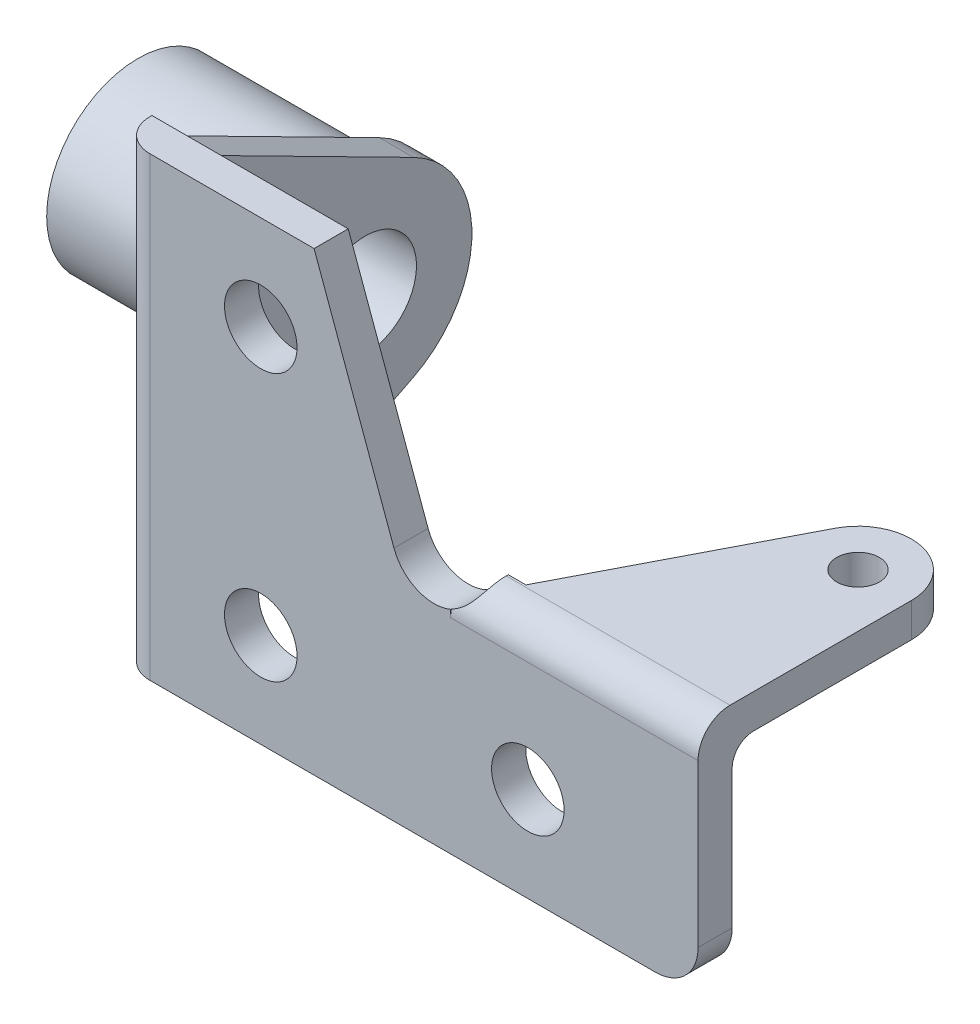
ISO-10303-21;
HEADER;
FILE_DESCRIPTION(('STEP AP214'),'2;1');
FILE_NAME('part.step','',(''),(''),'','','');
FILE_SCHEMA(('AUTOMOTIVE_DESIGN { 1 0 10303 214 1 1 1 1 }'));
ENDSEC;
DATA;
#1=APPLICATION_CONTEXT('core data for automotive mechanical design processes');
#2=APPLICATION_PROTOCOL_DEFINITION('international standard','automotive_design',2000,#1);
#3=PRODUCT_CONTEXT('',#1,'mechanical');
#4=PRODUCT('Part','Part','',(#3));
#5=PRODUCT_RELATED_PRODUCT_CATEGORY('part','',(#4));
#6=PRODUCT_DEFINITION_FORMATION('','',#4);
#7=PRODUCT_DEFINITION_CONTEXT('part definition',#1,'design');
#8=PRODUCT_DEFINITION('design','',#6,#7);
#9=PRODUCT_DEFINITION_SHAPE('','',#8);
#10=(LENGTH_UNIT() NAMED_UNIT(*) SI_UNIT(.MILLI.,.METRE.));
#11=(NAMED_UNIT(*) PLANE_ANGLE_UNIT() SI_UNIT($,.RADIAN.));
#12=(NAMED_UNIT(*) SI_UNIT($,.STERADIAN.) SOLID_ANGLE_UNIT());
#13=UNCERTAINTY_MEASURE_WITH_UNIT(LENGTH_MEASURE(1.E-05),#10,'distance_accuracy_value','');
#14=(GEOMETRIC_REPRESENTATION_CONTEXT(3) GLOBAL_UNCERTAINTY_ASSIGNED_CONTEXT((#13)) GLOBAL_UNIT_ASSIGNED_CONTEXT((#10,
#11,#12)) REPRESENTATION_CONTEXT('',''));
#15=CARTESIAN_POINT('',(0.,0.,0.));
#16=DIRECTION('',(0.,0.,1.));
#17=DIRECTION('',(1.,0.,0.));
#18=AXIS2_PLACEMENT_3D('',#15,#16,#17);
#19=CARTESIAN_POINT('',(18.8272914692572,14.9530311640472,2.032));
#20=DIRECTION('',(0.,0.,1.));
#21=DIRECTION('',(1.,0.,0.));
#22=AXIS2_PLACEMENT_3D('',#19,#20,#21);
#23=PLANE('',#22);
#24=CARTESIAN_POINT('',(8.509,5.6261,2.032));
#25=DIRECTION('',(0.,0.,1.));
#26=DIRECTION('',(1.,0.,0.));
#27=AXIS2_PLACEMENT_3D('',#24,#25,#26);
#28=CIRCLE('',#27,2.159);
#29=CARTESIAN_POINT('',(10.668,5.6261,2.032));
#30=VERTEX_POINT('',#29);
#31=EDGE_CURVE('E264',#30,#30,#28,.T.);
#32=ORIENTED_EDGE('',*,*,#31,.F.);
#33=EDGE_LOOP('',(#32));
#34=FACE_BOUND('',#33,.T.);
#35=CARTESIAN_POINT('',(8.509,21.5265,2.032));
#36=DIRECTION('',(0.,0.,1.));
#37=DIRECTION('',(1.,0.,0.));
#38=AXIS2_PLACEMENT_3D('',#35,#36,#37);
#39=CIRCLE('',#38,2.159);
#40=CARTESIAN_POINT('',(10.668,21.5265,2.032));
#41=VERTEX_POINT('',#40);
#42=EDGE_CURVE('E270',#41,#41,#39,.T.);
#43=ORIENTED_EDGE('',*,*,#42,.F.);
#44=EDGE_LOOP('',(#43));
#45=FACE_BOUND('',#44,.T.);
#46=CARTESIAN_POINT('',(24.4094,5.6261,2.032));
#47=DIRECTION('',(0.,0.,1.));
#48=DIRECTION('',(1.,0.,0.));
#49=AXIS2_PLACEMENT_3D('',#46,#47,#48);
#50=CIRCLE('',#49,2.159);
#51=CARTESIAN_POINT('',(26.5684,5.6261,2.032));
#52=VERTEX_POINT('',#51);
#53=EDGE_CURVE('E258',#52,#52,#50,.T.);
#54=ORIENTED_EDGE('',*,*,#53,.F.);
#55=EDGE_LOOP('',(#54));
#56=FACE_BOUND('',#55,.T.);
#57=DIRECTION('',(1.,0.,0.));
#58=VECTOR('',#57,1.);
#59=CARTESIAN_POINT('',(34.544,0.,2.032));
#60=LINE('',#59,#58);
#61=CARTESIAN_POINT('',(1.905,0.,2.032));
#62=VERTEX_POINT('',#61);
#63=CARTESIAN_POINT('',(32.004,0.,2.032));
#64=VERTEX_POINT('',#63);
#65=EDGE_CURVE('E276',#62,#64,#60,.T.);
#66=ORIENTED_EDGE('',*,*,#65,.T.);
#67=CARTESIAN_POINT('',(32.004,2.54,2.032));
#68=DIRECTION('',(0.,0.,1.));
#69=DIRECTION('',(1.,0.,0.));
#70=AXIS2_PLACEMENT_3D('',#67,#68,#69);
#71=CIRCLE('',#70,2.54);
#72=CARTESIAN_POINT('',(34.544,2.54,2.032));
#73=VERTEX_POINT('',#72);
#74=EDGE_CURVE('E11',#64,#73,#71,.T.);
#75=ORIENTED_EDGE('',*,*,#74,.T.);
#76=DIRECTION('',(0.,1.,0.));
#77=VECTOR('',#76,1.);
#78=CARTESIAN_POINT('',(34.544,14.0843,2.032));
#79=LINE('',#78,#77);
#80=CARTESIAN_POINT('',(34.544,12.1793,2.032));
#81=VERTEX_POINT('',#80);
#82=EDGE_CURVE('E191',#73,#81,#79,.T.);
#83=ORIENTED_EDGE('',*,*,#82,.T.);
#84=DIRECTION('',(1.,0.,0.));
#85=VECTOR('',#84,1.);
#86=CARTESIAN_POINT('',(19.812,12.1793,2.032));
#87=LINE('',#86,#85);
#88=CARTESIAN_POINT('',(19.812,12.1793,2.032));
#89=VERTEX_POINT('',#88);
#90=EDGE_CURVE('E184',#89,#81,#87,.T.);
#91=ORIENTED_EDGE('',*,*,#90,.F.);
#92=DIRECTION('',(0.,-1.,0.));
#93=VECTOR('',#92,1.);
#94=CARTESIAN_POINT('',(19.812,14.0843,2.032));
#95=LINE('',#94,#93);
#96=CARTESIAN_POINT('',(19.812,12.6116749097616,2.032));
#97=VERTEX_POINT('',#96);
#98=EDGE_CURVE('E169',#97,#89,#95,.T.);
#99=ORIENTED_EDGE('',*,*,#98,.F.);
#100=CARTESIAN_POINT('',(18.8272914692572,14.9530311640472,2.032));
#101=DIRECTION('',(0.,0.,-1.));
#102=DIRECTION('',(1.,0.,0.));
#103=AXIS2_PLACEMENT_3D('',#100,#101,#102);
#104=CIRCLE('',#103,2.54);
#105=CARTESIAN_POINT('',(16.440472212461,14.0843,2.032));
#106=VERTEX_POINT('',#105);
#107=EDGE_CURVE('E280',#97,#106,#104,.T.);
#108=ORIENTED_EDGE('',*,*,#107,.T.);
#109=DIRECTION('',(-0.342020143325666,0.93969262078591,0.));
#110=VECTOR('',#109,1.);
#111=CARTESIAN_POINT('',(11.684,27.1526,2.032));
#112=LINE('',#111,#110);
#113=CARTESIAN_POINT('',(11.684,27.1526,2.032));
#114=VERTEX_POINT('',#113);
#115=EDGE_CURVE('E282',#106,#114,#112,.T.);
#116=ORIENTED_EDGE('',*,*,#115,.T.);
#117=DIRECTION('',(-1.,0.,0.));
#118=VECTOR('',#117,1.);
#119=CARTESIAN_POINT('',(0.,27.1526,2.032));
#120=LINE('',#119,#118);
#121=CARTESIAN_POINT('',(1.905,27.1526,2.032));
#122=VERTEX_POINT('',#121);
#123=EDGE_CURVE('E284',#114,#122,#120,.T.);
#124=ORIENTED_EDGE('',*,*,#123,.T.);
#125=DIRECTION('',(0.,-1.,0.));
#126=VECTOR('',#125,1.);
#127=CARTESIAN_POINT('',(1.905,0.,2.032));
#128=LINE('',#127,#126);
#129=EDGE_CURVE('E327',#122,#62,#128,.T.);
#130=ORIENTED_EDGE('',*,*,#129,.T.);
#131=EDGE_LOOP('',(#66,#75,#83,#91,#99,#108,#116,#124,#130));
#132=FACE_BOUND('',#131,.T.);
#133=ADVANCED_FACE('F33',(#34,#45,#56,#132),#23,.T.);
#134=CARTESIAN_POINT('',(21.2141107260534,14.0843,2.032));
#135=DIRECTION('',(0.,-1.,0.));
#136=DIRECTION('',(0.,0.,-1.));
#137=AXIS2_PLACEMENT_3D('',#134,#135,#136);
#138=PLANE('',#137);
#139=CARTESIAN_POINT('',(31.369,14.0843,-10.668));
#140=DIRECTION('',(0.,1.,0.));
#141=DIRECTION('',(0.,0.,1.));
#142=AXIS2_PLACEMENT_3D('',#139,#140,#141);
#143=CIRCLE('',#142,1.27);
#144=CARTESIAN_POINT('',(31.369,14.0843,-9.398));
#145=VERTEX_POINT('',#144);
#146=EDGE_CURVE('E192',#145,#145,#143,.T.);
#147=ORIENTED_EDGE('',*,*,#146,.F.);
#148=EDGE_LOOP('',(#147));
#149=FACE_BOUND('',#148,.T.);
#150=DIRECTION('',(1.,0.,0.));
#151=VECTOR('',#150,1.);
#152=CARTESIAN_POINT('',(19.812,14.0843,0.127));
#153=LINE('',#152,#151);
#154=CARTESIAN_POINT('',(21.2141107260534,14.0843,0.127));
#155=VERTEX_POINT('',#154);
#156=CARTESIAN_POINT('',(34.544,14.0843,0.127));
#157=VERTEX_POINT('',#156);
#158=EDGE_CURVE('E179',#155,#157,#153,.T.);
#159=ORIENTED_EDGE('',*,*,#158,.T.);
#160=DIRECTION('',(0.,0.,-1.));
#161=VECTOR('',#160,1.);
#162=CARTESIAN_POINT('',(34.544,14.0843,2.032));
#163=LINE('',#162,#161);
#164=CARTESIAN_POINT('',(34.544,14.0843,-10.668));
#165=VERTEX_POINT('',#164);
#166=EDGE_CURVE('E315',#157,#165,#163,.T.);
#167=ORIENTED_EDGE('',*,*,#166,.T.);
#168=CARTESIAN_POINT('',(31.369,14.0843,-10.668));
#169=DIRECTION('',(0.,1.,0.));
#170=DIRECTION('',(0.,0.,1.));
#171=AXIS2_PLACEMENT_3D('',#168,#169,#170);
#172=CIRCLE('',#171,3.175);
#173=CARTESIAN_POINT('',(28.5498316436118,14.0843,-12.1284501971446));
#174=VERTEX_POINT('',#173);
#175=EDGE_CURVE('E202',#165,#174,#172,.T.);
#176=ORIENTED_EDGE('',*,*,#175,.T.);
#177=DIRECTION('',(-0.45998431406128,0.,0.887927041382102));
#178=VECTOR('',#177,1.);
#179=CARTESIAN_POINT('',(21.2141107260534,14.0843,2.032));
#180=LINE('',#179,#178);
#181=CARTESIAN_POINT('',(22.2667739321628,14.0843,0.));
#182=VERTEX_POINT('',#181);
#183=EDGE_CURVE('E207',#174,#182,#180,.T.);
#184=ORIENTED_EDGE('',*,*,#183,.T.);
#185=DIRECTION('',(-1.,0.,0.));
#186=VECTOR('',#185,1.);
#187=CARTESIAN_POINT('',(21.2141107260534,14.0843,0.));
#188=LINE('',#187,#186);
#189=CARTESIAN_POINT('',(21.2141107260534,14.0843,0.));
#190=VERTEX_POINT('',#189);
#191=EDGE_CURVE('E291',#182,#190,#188,.T.);
#192=ORIENTED_EDGE('',*,*,#191,.T.);
#193=DIRECTION('',(0.,0.,-1.));
#194=VECTOR('',#193,1.);
#195=CARTESIAN_POINT('',(21.2141107260534,14.0843,2.032));
#196=LINE('',#195,#194);
#197=EDGE_CURVE('E313',#155,#190,#196,.T.);
#198=ORIENTED_EDGE('',*,*,#197,.F.);
#199=EDGE_LOOP('',(#159,#167,#176,#184,#192,#198));
#200=FACE_BOUND('',#199,.T.);
#201=ADVANCED_FACE('F396',(#149,#200),#138,.F.);
#202=CARTESIAN_POINT('',(0.,0.,2.032));
#203=DIRECTION('',(1.,0.,0.));
#204=DIRECTION('',(0.,0.,-1.));
#205=AXIS2_PLACEMENT_3D('',#202,#203,#204);
#206=PLANE('',#205);
#207=DIRECTION('',(0.,0.,-1.));
#208=VECTOR('',#207,1.);
#209=CARTESIAN_POINT('',(0.,0.,2.032));
#210=LINE('',#209,#208);
#211=CARTESIAN_POINT('',(0.,0.,0.127));
#212=VERTEX_POINT('',#211);
#213=CARTESIAN_POINT('',(0.,0.,0.));
#214=VERTEX_POINT('',#213);
#215=EDGE_CURVE('E287',#212,#214,#210,.T.);
#216=ORIENTED_EDGE('',*,*,#215,.F.);
#217=DIRECTION('',(0.,-1.,0.));
#218=VECTOR('',#217,1.);
#219=CARTESIAN_POINT('',(0.,27.1526,0.127));
#220=LINE('',#219,#218);
#221=CARTESIAN_POINT('',(0.,27.1526,0.127));
#222=VERTEX_POINT('',#221);
#223=EDGE_CURVE('E430',#212,#222,#220,.F.);
#224=ORIENTED_EDGE('',*,*,#223,.T.);
#225=DIRECTION('',(0.,0.,-1.));
#226=VECTOR('',#225,1.);
#227=CARTESIAN_POINT('',(0.,27.1526,2.032));
#228=LINE('',#227,#226);
#229=CARTESIAN_POINT('',(0.,27.1526,0.));
#230=VERTEX_POINT('',#229);
#231=EDGE_CURVE('E305',#222,#230,#228,.T.);
#232=ORIENTED_EDGE('',*,*,#231,.T.);
#233=DIRECTION('',(0.,-1.,0.));
#234=VECTOR('',#233,1.);
#235=CARTESIAN_POINT('',(0.,0.,0.));
#236=LINE('',#235,#234);
#237=CARTESIAN_POINT('',(0.,26.1200412428547,0.));
#238=VERTEX_POINT('',#237);
#239=EDGE_CURVE('E278',#230,#238,#236,.T.);
#240=ORIENTED_EDGE('',*,*,#239,.T.);
#241=DIRECTION('',(0.,-0.453016032616668,-0.89150236914562));
#242=VECTOR('',#241,1.);
#243=CARTESIAN_POINT('',(0.,19.2373400440747,-13.5446518071158));
#244=LINE('',#243,#242);
#245=CARTESIAN_POINT('',(0.,19.2373400440747,-13.5446518071158));
#246=VERTEX_POINT('',#245);
#247=EDGE_CURVE('E232',#238,#246,#244,.T.);
#248=ORIENTED_EDGE('',*,*,#247,.T.);
#249=CARTESIAN_POINT('',(0.,13.5763,-10.668));
#250=DIRECTION('',(-1.,0.,0.));
#251=DIRECTION('',(0.,0.,1.));
#252=AXIS2_PLACEMENT_3D('',#249,#250,#251);
#253=CIRCLE('',#252,6.35);
#254=CARTESIAN_POINT('',(0.,7.91525995592531,-13.5446518071158));
#255=VERTEX_POINT('',#254);
#256=EDGE_CURVE('E244',#246,#255,#253,.T.);
#257=ORIENTED_EDGE('',*,*,#256,.T.);
#258=DIRECTION('',(0.,-0.453016032616668,0.89150236914562));
#259=VECTOR('',#258,1.);
#260=CARTESIAN_POINT('',(0.,0.,2.032));
#261=LINE('',#260,#259);
#262=CARTESIAN_POINT('',(0.,1.03255875714528,0.));
#263=VERTEX_POINT('',#262);
#264=EDGE_CURVE('E236',#255,#263,#261,.T.);
#265=ORIENTED_EDGE('',*,*,#264,.T.);
#266=EDGE_CURVE('E301',#263,#214,#236,.T.);
#267=ORIENTED_EDGE('',*,*,#266,.T.);
#268=EDGE_LOOP('',(#216,#224,#232,#240,#248,#257,#265,#267));
#269=FACE_BOUND('',#268,.T.);
#270=CARTESIAN_POINT('',(0.,13.5763,-10.668));
#271=DIRECTION('',(1.,0.,0.));
#272=DIRECTION('',(0.,0.,-1.));
#273=AXIS2_PLACEMENT_3D('',#270,#271,#272);
#274=CIRCLE('',#273,5.4356);
#275=CARTESIAN_POINT('',(0.,13.5763,-16.1036));
#276=VERTEX_POINT('',#275);
#277=EDGE_CURVE('E317',#276,#276,#274,.F.);
#278=ORIENTED_EDGE('',*,*,#277,.F.);
#279=EDGE_LOOP('',(#278));
#280=FACE_BOUND('',#279,.T.);
#281=ADVANCED_FACE('F402',(#269,#280),#206,.F.);
#282=CARTESIAN_POINT('',(18.8272914692572,14.9530311640472,0.));
#283=DIRECTION('',(0.,0.,1.));
#284=DIRECTION('',(1.,0.,0.));
#285=AXIS2_PLACEMENT_3D('',#282,#283,#284);
#286=PLANE('',#285);
#287=DIRECTION('',(0.,1.,0.));
#288=VECTOR('',#287,1.);
#289=CARTESIAN_POINT('',(34.544,14.0843,0.));
#290=LINE('',#289,#288);
#291=CARTESIAN_POINT('',(34.544,2.54,0.));
#292=VERTEX_POINT('',#291);
#293=CARTESIAN_POINT('',(34.544,10.7823,0.));
#294=VERTEX_POINT('',#293);
#295=EDGE_CURVE('E289',#292,#294,#290,.T.);
#296=ORIENTED_EDGE('',*,*,#295,.F.);
#297=CARTESIAN_POINT('',(32.004,2.54,0.));
#298=DIRECTION('',(0.,0.,1.));
#299=DIRECTION('',(1.,0.,0.));
#300=AXIS2_PLACEMENT_3D('',#297,#298,#299);
#301=CIRCLE('',#300,2.54);
#302=CARTESIAN_POINT('',(32.004,0.,0.));
#303=VERTEX_POINT('',#302);
#304=EDGE_CURVE('E55',#292,#303,#301,.F.);
#305=ORIENTED_EDGE('',*,*,#304,.T.);
#306=DIRECTION('',(1.,0.,0.));
#307=VECTOR('',#306,1.);
#308=CARTESIAN_POINT('',(34.544,0.,0.));
#309=LINE('',#308,#307);
#310=EDGE_CURVE('E273',#214,#303,#309,.T.);
#311=ORIENTED_EDGE('',*,*,#310,.F.);
#312=ORIENTED_EDGE('',*,*,#266,.F.);
#313=DIRECTION('',(1.,0.,0.));
#314=VECTOR('',#313,1.);
#315=CARTESIAN_POINT('',(18.8272914692572,1.03255875714527,0.));
#316=LINE('',#315,#314);
#317=CARTESIAN_POINT('',(3.302,1.03255875714527,0.));
#318=VERTEX_POINT('',#317);
#319=EDGE_CURVE('E255',#263,#318,#316,.T.);
#320=ORIENTED_EDGE('',*,*,#319,.T.);
#321=DIRECTION('',(0.,-1.,0.));
#322=VECTOR('',#321,1.);
#323=CARTESIAN_POINT('',(3.302,26.1200412428547,0.));
#324=LINE('',#323,#322);
#325=CARTESIAN_POINT('',(3.302,26.1200412428547,0.));
#326=VERTEX_POINT('',#325);
#327=EDGE_CURVE('E447',#318,#326,#324,.F.);
#328=ORIENTED_EDGE('',*,*,#327,.T.);
#329=DIRECTION('',(-1.,0.,0.));
#330=VECTOR('',#329,1.);
#331=CARTESIAN_POINT('',(18.8272914692572,26.1200412428547,0.));
#332=LINE('',#331,#330);
#333=EDGE_CURVE('E250',#326,#238,#332,.T.);
#334=ORIENTED_EDGE('',*,*,#333,.T.);
#335=ORIENTED_EDGE('',*,*,#239,.F.);
#336=DIRECTION('',(-1.,0.,0.));
#337=VECTOR('',#336,1.);
#338=CARTESIAN_POINT('',(0.,27.1526,0.));
#339=LINE('',#338,#337);
#340=CARTESIAN_POINT('',(11.684,27.1526,0.));
#341=VERTEX_POINT('',#340);
#342=EDGE_CURVE('E298',#341,#230,#339,.T.);
#343=ORIENTED_EDGE('',*,*,#342,.F.);
#344=DIRECTION('',(-0.342020143325666,0.93969262078591,0.));
#345=VECTOR('',#344,1.);
#346=CARTESIAN_POINT('',(11.684,27.1526,0.));
#347=LINE('',#346,#345);
#348=CARTESIAN_POINT('',(16.440472212461,14.0843,0.));
#349=VERTEX_POINT('',#348);
#350=EDGE_CURVE('E296',#349,#341,#347,.T.);
#351=ORIENTED_EDGE('',*,*,#350,.F.);
#352=CARTESIAN_POINT('',(18.8272914692572,14.9530311640472,0.));
#353=DIRECTION('',(0.,0.,-1.));
#354=DIRECTION('',(1.,0.,0.));
#355=AXIS2_PLACEMENT_3D('',#352,#353,#354);
#356=CIRCLE('',#355,2.54);
#357=EDGE_CURVE('E294',#190,#349,#356,.T.);
#358=ORIENTED_EDGE('',*,*,#357,.F.);
#359=ORIENTED_EDGE('',*,*,#191,.F.);
#360=DIRECTION('',(0.,-1.,0.));
#361=VECTOR('',#360,1.);
#362=CARTESIAN_POINT('',(22.2667739321628,14.9530311640472,0.));
#363=LINE('',#362,#361);
#364=CARTESIAN_POINT('',(22.2667739321628,10.7823,0.));
#365=VERTEX_POINT('',#364);
#366=EDGE_CURVE('E219',#182,#365,#363,.T.);
#367=ORIENTED_EDGE('',*,*,#366,.T.);
#368=DIRECTION('',(-1.,0.,0.));
#369=VECTOR('',#368,1.);
#370=CARTESIAN_POINT('',(34.544,10.7823,0.));
#371=LINE('',#370,#369);
#372=EDGE_CURVE('E440',#365,#294,#371,.F.);
#373=ORIENTED_EDGE('',*,*,#372,.T.);
#374=EDGE_LOOP('',(#296,#305,#311,#312,#320,#328,#334,#335,#343,#351,#358,#359,#367,#373));
#375=FACE_BOUND('',#374,.T.);
#376=CARTESIAN_POINT('',(8.509,5.6261,0.));
#377=DIRECTION('',(0.,0.,1.));
#378=DIRECTION('',(1.,0.,0.));
#379=AXIS2_PLACEMENT_3D('',#376,#377,#378);
#380=CIRCLE('',#379,2.159);
#381=CARTESIAN_POINT('',(10.668,5.6261,0.));
#382=VERTEX_POINT('',#381);
#383=EDGE_CURVE('E261',#382,#382,#380,.T.);
#384=ORIENTED_EDGE('',*,*,#383,.T.);
#385=EDGE_LOOP('',(#384));
#386=FACE_BOUND('',#385,.T.);
#387=CARTESIAN_POINT('',(8.509,21.5265,0.));
#388=DIRECTION('',(0.,0.,1.));
#389=DIRECTION('',(1.,0.,0.));
#390=AXIS2_PLACEMENT_3D('',#387,#388,#389);
#391=CIRCLE('',#390,2.159);
#392=CARTESIAN_POINT('',(10.668,21.5265,0.));
#393=VERTEX_POINT('',#392);
#394=EDGE_CURVE('E267',#393,#393,#391,.T.);
#395=ORIENTED_EDGE('',*,*,#394,.T.);
#396=EDGE_LOOP('',(#395));
#397=FACE_BOUND('',#396,.T.);
#398=CARTESIAN_POINT('',(24.4094,5.6261,0.));
#399=DIRECTION('',(0.,0.,1.));
#400=DIRECTION('',(1.,0.,0.));
#401=AXIS2_PLACEMENT_3D('',#398,#399,#400);
#402=CIRCLE('',#401,2.159);
#403=CARTESIAN_POINT('',(26.5684,5.6261,0.));
#404=VERTEX_POINT('',#403);
#405=EDGE_CURVE('E257',#404,#404,#402,.T.);
#406=ORIENTED_EDGE('',*,*,#405,.T.);
#407=EDGE_LOOP('',(#406));
#408=FACE_BOUND('',#407,.T.);
#409=ADVANCED_FACE('F398',(#375,#386,#397,#408),#286,.F.);
#410=CARTESIAN_POINT('',(34.544,0.,2.032));
#411=DIRECTION('',(0.,1.,0.));
#412=DIRECTION('',(-1.,0.,0.));
#413=AXIS2_PLACEMENT_3D('',#410,#411,#412);
#414=PLANE('',#413);
#415=ORIENTED_EDGE('',*,*,#310,.T.);
#416=DIRECTION('',(0.,0.,-1.));
#417=VECTOR('',#416,1.);
#418=CARTESIAN_POINT('',(32.004,0.,2.032));
#419=LINE('',#418,#417);
#420=EDGE_CURVE('E41',#303,#64,#419,.F.);
#421=ORIENTED_EDGE('',*,*,#420,.T.);
#422=ORIENTED_EDGE('',*,*,#65,.F.);
#423=CARTESIAN_POINT('',(1.905,0.,0.127));
#424=DIRECTION('',(0.,1.,0.));
#425=DIRECTION('',(-1.,0.,0.));
#426=AXIS2_PLACEMENT_3D('',#423,#424,#425);
#427=CIRCLE('',#426,1.905);
#428=EDGE_CURVE('E442',#62,#212,#427,.F.);
#429=ORIENTED_EDGE('',*,*,#428,.T.);
#430=ORIENTED_EDGE('',*,*,#215,.T.);
#431=EDGE_LOOP('',(#415,#421,#422,#429,#430));
#432=FACE_BOUND('',#431,.T.);
#433=ADVANCED_FACE('F401',(#432),#414,.F.);
#434=CARTESIAN_POINT('',(34.544,14.0843,2.032));
#435=DIRECTION('',(-1.,0.,0.));
#436=DIRECTION('',(0.,0.,1.));
#437=AXIS2_PLACEMENT_3D('',#434,#435,#436);
#438=PLANE('',#437);
#439=ORIENTED_EDGE('',*,*,#82,.F.);
#440=DIRECTION('',(0.,0.,-1.));
#441=VECTOR('',#440,1.);
#442=CARTESIAN_POINT('',(34.544,2.54,2.032));
#443=LINE('',#442,#441);
#444=EDGE_CURVE('E462',#73,#292,#443,.T.);
#445=ORIENTED_EDGE('',*,*,#444,.T.);
#446=ORIENTED_EDGE('',*,*,#295,.T.);
#447=CARTESIAN_POINT('',(34.544,10.7823,-1.27));
#448=DIRECTION('',(-1.,0.,0.));
#449=DIRECTION('',(0.,0.,1.));
#450=AXIS2_PLACEMENT_3D('',#447,#448,#449);
#451=CIRCLE('',#450,1.27);
#452=CARTESIAN_POINT('',(34.544,12.0523,-1.27));
#453=VERTEX_POINT('',#452);
#454=EDGE_CURVE('E460',#294,#453,#451,.T.);
#455=ORIENTED_EDGE('',*,*,#454,.T.);
#456=DIRECTION('',(0.,0.,-1.));
#457=VECTOR('',#456,1.);
#458=CARTESIAN_POINT('',(34.544,12.0523,-10.668));
#459=LINE('',#458,#457);
#460=CARTESIAN_POINT('',(34.544,12.0523,-10.668));
#461=VERTEX_POINT('',#460);
#462=EDGE_CURVE('E204',#453,#461,#459,.T.);
#463=ORIENTED_EDGE('',*,*,#462,.T.);
#464=DIRECTION('',(0.,1.,0.));
#465=VECTOR('',#464,1.);
#466=CARTESIAN_POINT('',(34.544,12.0523,-10.668));
#467=LINE('',#466,#465);
#468=EDGE_CURVE('E213',#461,#165,#467,.T.);
#469=ORIENTED_EDGE('',*,*,#468,.T.);
#470=ORIENTED_EDGE('',*,*,#166,.F.);
#471=CARTESIAN_POINT('',(34.544,12.1793,0.127));
#472=DIRECTION('',(-1.,0.,0.));
#473=DIRECTION('',(0.,0.,-1.));
#474=AXIS2_PLACEMENT_3D('',#471,#472,#473);
#475=CIRCLE('',#474,1.905);
#476=EDGE_CURVE('E188',#81,#157,#475,.T.);
#477=ORIENTED_EDGE('',*,*,#476,.F.);
#478=EDGE_LOOP('',(#439,#445,#446,#455,#463,#469,#470,#477));
#479=FACE_BOUND('',#478,.T.);
#480=ADVANCED_FACE('F414',(#479),#438,.F.);
#481=CARTESIAN_POINT('',(18.8272914692572,14.9530311640472,2.032));
#482=DIRECTION('',(0.,0.,-1.));
#483=DIRECTION('',(-1.,0.,0.));
#484=AXIS2_PLACEMENT_3D('',#481,#482,#483);
#485=CYLINDRICAL_SURFACE('',#484,2.54);
#486=DIRECTION('',(0.,0.,-1.));
#487=VECTOR('',#486,1.);
#488=CARTESIAN_POINT('',(19.812,12.6116749097616,2.032));
#489=LINE('',#488,#487);
#490=CARTESIAN_POINT('',(19.812,12.6116749097616,1.98228351941386));
#491=VERTEX_POINT('',#490);
#492=EDGE_CURVE('E175',#491,#97,#489,.F.);
#493=ORIENTED_EDGE('',*,*,#492,.F.);
#494=CARTESIAN_POINT('',(19.812,12.6116749097616,1.98228351941386));
#495=CARTESIAN_POINT('',(19.8654658090277,12.6341499540127,1.97703525247875));
#496=CARTESIAN_POINT('',(19.9180972557236,12.6584510443361,1.97095115480035));
#497=CARTESIAN_POINT('',(20.0213939864932,12.7104762821756,1.95664908363561));
#498=CARTESIAN_POINT('',(20.0720575609972,12.7382033222349,1.94842930043531));
#499=CARTESIAN_POINT('',(20.1713978904913,12.7970307852467,1.92933009830586));
#500=CARTESIAN_POINT('',(20.2200570215826,12.828154811927,1.91843131192794));
#501=CARTESIAN_POINT('',(20.3145992822519,12.8932238469485,1.89350830661012));
#502=CARTESIAN_POINT('',(20.3604831449678,12.9271681046002,1.87948491771669));
#503=CARTESIAN_POINT('',(20.4494468675855,12.9976651406021,1.84770000204782));
#504=CARTESIAN_POINT('',(20.4925030378049,13.0342356207684,1.82991114858996));
#505=CARTESIAN_POINT('',(20.5750533761396,13.1091133171814,1.79020994727755));
#506=CARTESIAN_POINT('',(20.6145482038234,13.1474202098579,1.768298365291));
#507=CARTESIAN_POINT('',(20.6894989091642,13.2248323730471,1.72009544967508));
#508=CARTESIAN_POINT('',(20.724972118894,13.2639332886168,1.69382421468049));
#509=CARTESIAN_POINT('',(20.7918448418693,13.3421974711604,1.63665193225431));
#510=CARTESIAN_POINT('',(20.8232452594718,13.3813607223311,1.60575191593138));
#511=CARTESIAN_POINT('',(20.9023787685858,13.4859269396568,1.51596944938867));
#512=CARTESIAN_POINT('',(20.9462034013381,13.5505541304603,1.45261552493721));
#513=CARTESIAN_POINT('',(21.0222086464549,13.6727337946343,1.31328875532211));
#514=CARTESIAN_POINT('',(21.0543784871777,13.7302796910355,1.23730433086226));
#515=CARTESIAN_POINT('',(21.1064234382671,13.8304874914754,1.08122425208416));
#516=CARTESIAN_POINT('',(21.1270521446602,13.8739523313875,1.00189059834924));
#517=CARTESIAN_POINT('',(21.1610369195161,13.9495584401508,0.836563044808099));
#518=CARTESIAN_POINT('',(21.1743918748135,13.9816979755268,0.75056812786983));
#519=CARTESIAN_POINT('',(21.1949081503281,14.0328456877182,0.575896018845059));
#520=CARTESIAN_POINT('',(21.2021860553918,14.0520995624865,0.487304777143225));
#521=CARTESIAN_POINT('',(21.2093828089124,14.0713956366054,0.352950950691451));
#522=CARTESIAN_POINT('',(21.2111617059997,14.0762302067042,0.307919933948006));
#523=CARTESIAN_POINT('',(21.213522774907,14.0826826495616,0.217598379619976));
#524=CARTESIAN_POINT('',(21.2141049920591,14.0843006441693,0.172307851931269));
#525=CARTESIAN_POINT('',(21.2141107260534,14.0843,0.127));
#526=B_SPLINE_CURVE_WITH_KNOTS('',3,(#494,#495,#496,#497,#498,#499,#500,#501,#502,#503,#504,
#505,#506,#507,#508,#509,#510,#511,#512,#513,#514,#515,#516,#517,#518,#519,#520,#521,#522,#523,
#524,#525),.UNSPECIFIED.,.F.,.F.,(4,2,2,2,2,2,2,2,2,2,2,2,2,2,2,4),(0.,0.17468507522086,
0.349518658691595,0.525655398811907,0.701745404112138,0.879160051261085,1.05654177305838,
1.23312736835611,1.40967368573089,1.70951514182043,2.00963301593704,2.28673829777974,
2.56388597554077,2.8355859136934,2.97144724708212,3.10730343372648),.UNSPECIFIED.);
#527=EDGE_CURVE('E187',#491,#155,#526,.T.);
#528=ORIENTED_EDGE('',*,*,#527,.T.);
#529=ORIENTED_EDGE('',*,*,#197,.T.);
#530=ORIENTED_EDGE('',*,*,#357,.T.);
#531=DIRECTION('',(0.,0.,-1.));
#532=VECTOR('',#531,1.);
#533=CARTESIAN_POINT('',(16.440472212461,14.0843,2.032));
#534=LINE('',#533,#532);
#535=EDGE_CURVE('E310',#106,#349,#534,.T.);
#536=ORIENTED_EDGE('',*,*,#535,.F.);
#537=ORIENTED_EDGE('',*,*,#107,.F.);
#538=EDGE_LOOP('',(#493,#528,#529,#530,#536,#537));
#539=FACE_BOUND('',#538,.T.);
#540=ADVANCED_FACE('F329',(#539),#485,.F.);
#541=CARTESIAN_POINT('',(11.684,27.1526,2.032));
#542=DIRECTION('',(-0.93969262078591,-0.342020143325666,0.));
#543=DIRECTION('',(0.342020143325666,-0.93969262078591,0.));
#544=AXIS2_PLACEMENT_3D('',#541,#542,#543);
#545=PLANE('',#544);
#546=ORIENTED_EDGE('',*,*,#350,.T.);
#547=DIRECTION('',(0.,0.,-1.));
#548=VECTOR('',#547,1.);
#549=CARTESIAN_POINT('',(11.684,27.1526,2.032));
#550=LINE('',#549,#548);
#551=EDGE_CURVE('E307',#114,#341,#550,.T.);
#552=ORIENTED_EDGE('',*,*,#551,.F.);
#553=ORIENTED_EDGE('',*,*,#115,.F.);
#554=ORIENTED_EDGE('',*,*,#535,.T.);
#555=EDGE_LOOP('',(#546,#552,#553,#554));
#556=FACE_BOUND('',#555,.T.);
#557=ADVANCED_FACE('F407',(#556),#545,.F.);
#558=CARTESIAN_POINT('',(0.,27.1526,2.032));
#559=DIRECTION('',(0.,-1.,0.));
#560=DIRECTION('',(0.,0.,-1.));
#561=AXIS2_PLACEMENT_3D('',#558,#559,#560);
#562=PLANE('',#561);
#563=ORIENTED_EDGE('',*,*,#231,.F.);
#564=CARTESIAN_POINT('',(1.905,27.1526,0.127));
#565=DIRECTION('',(0.,-1.,0.));
#566=DIRECTION('',(0.,0.,-1.));
#567=AXIS2_PLACEMENT_3D('',#564,#565,#566);
#568=CIRCLE('',#567,1.905);
#569=EDGE_CURVE('E432',#222,#122,#568,.F.);
#570=ORIENTED_EDGE('',*,*,#569,.T.);
#571=ORIENTED_EDGE('',*,*,#123,.F.);
#572=ORIENTED_EDGE('',*,*,#551,.T.);
#573=ORIENTED_EDGE('',*,*,#342,.T.);
#574=EDGE_LOOP('',(#563,#570,#571,#572,#573));
#575=FACE_BOUND('',#574,.T.);
#576=ADVANCED_FACE('F392',(#575),#562,.F.);
#577=CARTESIAN_POINT('',(8.509,21.5265,2.032));
#578=DIRECTION('',(0.,0.,-1.));
#579=DIRECTION('',(-1.,0.,0.));
#580=AXIS2_PLACEMENT_3D('',#577,#578,#579);
#581=CYLINDRICAL_SURFACE('',#580,2.159);
#582=ORIENTED_EDGE('',*,*,#42,.T.);
#583=EDGE_LOOP('',(#582));
#584=FACE_BOUND('',#583,.T.);
#585=ORIENTED_EDGE('',*,*,#394,.F.);
#586=EDGE_LOOP('',(#585));
#587=FACE_BOUND('',#586,.T.);
#588=ADVANCED_FACE('F388',(#584,#587),#581,.F.);
#589=CARTESIAN_POINT('',(8.509,5.6261,2.032));
#590=DIRECTION('',(0.,0.,-1.));
#591=DIRECTION('',(-1.,0.,0.));
#592=AXIS2_PLACEMENT_3D('',#589,#590,#591);
#593=CYLINDRICAL_SURFACE('',#592,2.159);
#594=ORIENTED_EDGE('',*,*,#31,.T.);
#595=EDGE_LOOP('',(#594));
#596=FACE_BOUND('',#595,.T.);
#597=ORIENTED_EDGE('',*,*,#383,.F.);
#598=EDGE_LOOP('',(#597));
#599=FACE_BOUND('',#598,.T.);
#600=ADVANCED_FACE('F384',(#596,#599),#593,.F.);
#601=CARTESIAN_POINT('',(24.4094,5.6261,2.032));
#602=DIRECTION('',(0.,0.,-1.));
#603=DIRECTION('',(-1.,0.,0.));
#604=AXIS2_PLACEMENT_3D('',#601,#602,#603);
#605=CYLINDRICAL_SURFACE('',#604,2.159);
#606=ORIENTED_EDGE('',*,*,#53,.T.);
#607=EDGE_LOOP('',(#606));
#608=FACE_BOUND('',#607,.T.);
#609=ORIENTED_EDGE('',*,*,#405,.F.);
#610=EDGE_LOOP('',(#609));
#611=FACE_BOUND('',#610,.T.);
#612=ADVANCED_FACE('F370',(#608,#611),#605,.F.);
#613=CARTESIAN_POINT('',(2.032,13.5763,-10.668));
#614=DIRECTION('',(-1.,0.,0.));
#615=DIRECTION('',(0.,0.,1.));
#616=AXIS2_PLACEMENT_3D('',#613,#614,#615);
#617=PLANE('',#616);
#618=CARTESIAN_POINT('',(2.032,13.5763,-10.668));
#619=DIRECTION('',(-1.,0.,0.));
#620=DIRECTION('',(0.,0.,1.));
#621=AXIS2_PLACEMENT_3D('',#618,#619,#620);
#622=CIRCLE('',#621,3.048);
#623=CARTESIAN_POINT('',(2.032,13.5763,-7.62));
#624=VERTEX_POINT('',#623);
#625=EDGE_CURVE('E226',#624,#624,#622,.T.);
#626=ORIENTED_EDGE('',*,*,#625,.T.);
#627=EDGE_LOOP('',(#626));
#628=FACE_BOUND('',#627,.T.);
#629=DIRECTION('',(0.,-0.453016032616668,-0.89150236914562));
#630=VECTOR('',#629,1.);
#631=CARTESIAN_POINT('',(2.032,19.2373400440747,-13.5446518071158));
#632=LINE('',#631,#630);
#633=CARTESIAN_POINT('',(2.032,25.4746920196389,-1.27));
#634=VERTEX_POINT('',#633);
#635=CARTESIAN_POINT('',(2.032,19.2373400440747,-13.5446518071158));
#636=VERTEX_POINT('',#635);
#637=EDGE_CURVE('E233',#634,#636,#632,.T.);
#638=ORIENTED_EDGE('',*,*,#637,.F.);
#639=DIRECTION('',(0.,-1.,0.));
#640=VECTOR('',#639,1.);
#641=CARTESIAN_POINT('',(2.032,1.03255875714527,-1.27));
#642=LINE('',#641,#640);
#643=CARTESIAN_POINT('',(2.032,1.67790798036107,-1.27));
#644=VERTEX_POINT('',#643);
#645=EDGE_CURVE('E437',#634,#644,#642,.T.);
#646=ORIENTED_EDGE('',*,*,#645,.T.);
#647=DIRECTION('',(0.,-0.453016032616668,0.89150236914562));
#648=VECTOR('',#647,1.);
#649=CARTESIAN_POINT('',(2.032,0.,2.032));
#650=LINE('',#649,#648);
#651=CARTESIAN_POINT('',(2.032,7.91525995592531,-13.5446518071158));
#652=VERTEX_POINT('',#651);
#653=EDGE_CURVE('E239',#652,#644,#650,.T.);
#654=ORIENTED_EDGE('',*,*,#653,.F.);
#655=CARTESIAN_POINT('',(2.032,13.5763,-10.668));
#656=DIRECTION('',(-1.,0.,0.));
#657=DIRECTION('',(0.,0.,1.));
#658=AXIS2_PLACEMENT_3D('',#655,#656,#657);
#659=CIRCLE('',#658,6.35);
#660=EDGE_CURVE('E235',#636,#652,#659,.T.);
#661=ORIENTED_EDGE('',*,*,#660,.F.);
#662=EDGE_LOOP('',(#638,#646,#654,#661));
#663=FACE_BOUND('',#662,.T.);
#664=ADVANCED_FACE('F366',(#628,#663),#617,.F.);
#665=CARTESIAN_POINT('',(2.032,0.,2.032));
#666=DIRECTION('',(0.,-0.89150236914562,-0.453016032616668));
#667=DIRECTION('',(0.,0.453016032616668,-0.89150236914562));
#668=AXIS2_PLACEMENT_3D('',#665,#666,#667);
#669=PLANE('',#668);
#670=ORIENTED_EDGE('',*,*,#319,.F.);
#671=ORIENTED_EDGE('',*,*,#264,.F.);
#672=DIRECTION('',(-1.,0.,0.));
#673=VECTOR('',#672,1.);
#674=CARTESIAN_POINT('',(2.032,7.91525995592531,-13.5446518071158));
#675=LINE('',#674,#673);
#676=EDGE_CURVE('E248',#652,#255,#675,.T.);
#677=ORIENTED_EDGE('',*,*,#676,.F.);
#678=ORIENTED_EDGE('',*,*,#653,.T.);
#679=CARTESIAN_POINT('',(3.302,1.67790798036107,-1.27));
#680=DIRECTION('',(0.,-0.89150236914562,-0.453016032616668));
#681=DIRECTION('',(0.,0.453016032616668,-0.89150236914562));
#682=AXIS2_PLACEMENT_3D('',#679,#680,#681);
#683=ELLIPSE('',#682,1.42456155356841,1.27);
#684=EDGE_CURVE('E452',#644,#318,#683,.F.);
#685=ORIENTED_EDGE('',*,*,#684,.T.);
#686=EDGE_LOOP('',(#670,#671,#677,#678,#685));
#687=FACE_BOUND('',#686,.T.);
#688=ADVANCED_FACE('F369',(#687),#669,.T.);
#689=CARTESIAN_POINT('',(2.032,19.2373400440747,-13.5446518071158));
#690=DIRECTION('',(0.,0.89150236914562,-0.453016032616668));
#691=DIRECTION('',(0.,0.453016032616668,0.89150236914562));
#692=AXIS2_PLACEMENT_3D('',#689,#690,#691);
#693=PLANE('',#692);
#694=ORIENTED_EDGE('',*,*,#333,.F.);
#695=CARTESIAN_POINT('',(3.302,25.4746920196389,-1.27));
#696=DIRECTION('',(0.,0.89150236914562,-0.453016032616668));
#697=DIRECTION('',(0.,0.453016032616668,0.89150236914562));
#698=AXIS2_PLACEMENT_3D('',#695,#696,#697);
#699=ELLIPSE('',#698,1.42456155356841,1.27);
#700=EDGE_CURVE('E455',#326,#634,#699,.F.);
#701=ORIENTED_EDGE('',*,*,#700,.T.);
#702=ORIENTED_EDGE('',*,*,#637,.T.);
#703=DIRECTION('',(-1.,0.,0.));
#704=VECTOR('',#703,1.);
#705=CARTESIAN_POINT('',(2.032,19.2373400440747,-13.5446518071158));
#706=LINE('',#705,#704);
#707=EDGE_CURVE('E242',#636,#246,#706,.T.);
#708=ORIENTED_EDGE('',*,*,#707,.T.);
#709=ORIENTED_EDGE('',*,*,#247,.F.);
#710=EDGE_LOOP('',(#694,#701,#702,#708,#709));
#711=FACE_BOUND('',#710,.T.);
#712=ADVANCED_FACE('F374',(#711),#693,.T.);
#713=CARTESIAN_POINT('',(2.032,13.5763,-10.668));
#714=DIRECTION('',(-1.,0.,0.));
#715=DIRECTION('',(0.,0.,1.));
#716=AXIS2_PLACEMENT_3D('',#713,#714,#715);
#717=CYLINDRICAL_SURFACE('',#716,6.35);
#718=ORIENTED_EDGE('',*,*,#256,.F.);
#719=ORIENTED_EDGE('',*,*,#707,.F.);
#720=ORIENTED_EDGE('',*,*,#660,.T.);
#721=ORIENTED_EDGE('',*,*,#676,.T.);
#722=EDGE_LOOP('',(#718,#719,#720,#721));
#723=FACE_BOUND('',#722,.T.);
#724=ADVANCED_FACE('F364',(#723),#717,.T.);
#725=CARTESIAN_POINT('',(-11.5,13.5763,-10.668));
#726=DIRECTION('',(1.,0.,0.));
#727=DIRECTION('',(0.,0.,-1.));
#728=AXIS2_PLACEMENT_3D('',#725,#726,#727);
#729=CYLINDRICAL_SURFACE('',#728,5.4356);
#730=CARTESIAN_POINT('',(-11.5,13.5763,-10.668));
#731=DIRECTION('',(-1.,0.,0.));
#732=DIRECTION('',(0.,0.,1.));
#733=AXIS2_PLACEMENT_3D('',#730,#731,#732);
#734=CIRCLE('',#733,5.4356);
#735=CARTESIAN_POINT('',(-11.5,13.5763,-5.2324));
#736=VERTEX_POINT('',#735);
#737=EDGE_CURVE('E229',#736,#736,#734,.T.);
#738=ORIENTED_EDGE('',*,*,#737,.F.);
#739=EDGE_LOOP('',(#738));
#740=FACE_BOUND('',#739,.T.);
#741=ORIENTED_EDGE('',*,*,#277,.T.);
#742=EDGE_LOOP('',(#741));
#743=FACE_BOUND('',#742,.T.);
#744=ADVANCED_FACE('F360',(#740,#743),#729,.T.);
#745=CARTESIAN_POINT('',(-11.5,13.5763,-10.668));
#746=DIRECTION('',(-1.,0.,0.));
#747=DIRECTION('',(0.,0.,1.));
#748=AXIS2_PLACEMENT_3D('',#745,#746,#747);
#749=PLANE('',#748);
#750=CARTESIAN_POINT('',(-11.5,13.5763,-10.668));
#751=DIRECTION('',(-1.,0.,0.));
#752=DIRECTION('',(0.,0.,1.));
#753=AXIS2_PLACEMENT_3D('',#750,#751,#752);
#754=CIRCLE('',#753,3.048);
#755=CARTESIAN_POINT('',(-11.5,13.5763,-7.62));
#756=VERTEX_POINT('',#755);
#757=EDGE_CURVE('E223',#756,#756,#754,.T.);
#758=ORIENTED_EDGE('',*,*,#757,.F.);
#759=EDGE_LOOP('',(#758));
#760=FACE_BOUND('',#759,.T.);
#761=ORIENTED_EDGE('',*,*,#737,.T.);
#762=EDGE_LOOP('',(#761));
#763=FACE_BOUND('',#762,.T.);
#764=ADVANCED_FACE('F356',(#760,#763),#749,.T.);
#765=CARTESIAN_POINT('',(34.544,13.5763,-10.668));
#766=DIRECTION('',(-1.,0.,0.));
#767=DIRECTION('',(0.,0.,1.));
#768=AXIS2_PLACEMENT_3D('',#765,#766,#767);
#769=CYLINDRICAL_SURFACE('',#768,3.048);
#770=ORIENTED_EDGE('',*,*,#757,.T.);
#771=EDGE_LOOP('',(#770));
#772=FACE_BOUND('',#771,.T.);
#773=ORIENTED_EDGE('',*,*,#625,.F.);
#774=EDGE_LOOP('',(#773));
#775=FACE_BOUND('',#774,.T.);
#776=ADVANCED_FACE('F346',(#772,#775),#769,.F.);
#777=CARTESIAN_POINT('',(31.369,12.0523,-10.668));
#778=DIRECTION('',(0.,1.,0.));
#779=DIRECTION('',(0.,0.,1.));
#780=AXIS2_PLACEMENT_3D('',#777,#778,#779);
#781=PLANE('',#780);
#782=CARTESIAN_POINT('',(31.369,12.0523,-10.668));
#783=DIRECTION('',(0.,1.,0.));
#784=DIRECTION('',(0.,0.,1.));
#785=AXIS2_PLACEMENT_3D('',#782,#783,#784);
#786=CIRCLE('',#785,1.27);
#787=CARTESIAN_POINT('',(31.369,12.0523,-9.398));
#788=VERTEX_POINT('',#787);
#789=EDGE_CURVE('E195',#788,#788,#786,.T.);
#790=ORIENTED_EDGE('',*,*,#789,.T.);
#791=EDGE_LOOP('',(#790));
#792=FACE_BOUND('',#791,.T.);
#793=ORIENTED_EDGE('',*,*,#462,.F.);
#794=DIRECTION('',(-1.,0.,0.));
#795=VECTOR('',#794,1.);
#796=CARTESIAN_POINT('',(22.2667739321628,12.0523,-1.27));
#797=LINE('',#796,#795);
#798=CARTESIAN_POINT('',(22.9246884359812,12.0523,-1.27));
#799=VERTEX_POINT('',#798);
#800=EDGE_CURVE('E449',#453,#799,#797,.T.);
#801=ORIENTED_EDGE('',*,*,#800,.T.);
#802=DIRECTION('',(-0.45998431406128,0.,0.887927041382102));
#803=VECTOR('',#802,1.);
#804=CARTESIAN_POINT('',(21.2141107260534,12.0523,2.032));
#805=LINE('',#804,#803);
#806=CARTESIAN_POINT('',(28.5498316436118,12.0523,-12.1284501971446));
#807=VERTEX_POINT('',#806);
#808=EDGE_CURVE('E210',#807,#799,#805,.T.);
#809=ORIENTED_EDGE('',*,*,#808,.F.);
#810=CARTESIAN_POINT('',(31.369,12.0523,-10.668));
#811=DIRECTION('',(0.,1.,0.));
#812=DIRECTION('',(0.,0.,1.));
#813=AXIS2_PLACEMENT_3D('',#810,#811,#812);
#814=CIRCLE('',#813,3.175);
#815=EDGE_CURVE('E206',#461,#807,#814,.T.);
#816=ORIENTED_EDGE('',*,*,#815,.F.);
#817=EDGE_LOOP('',(#793,#801,#809,#816));
#818=FACE_BOUND('',#817,.T.);
#819=ADVANCED_FACE('F342',(#792,#818),#781,.F.);
#820=CARTESIAN_POINT('',(21.2141107260534,12.0523,2.032));
#821=DIRECTION('',(-0.887927041382102,0.,-0.45998431406128));
#822=DIRECTION('',(-0.45998431406128,0.,0.887927041382102));
#823=AXIS2_PLACEMENT_3D('',#820,#821,#822);
#824=PLANE('',#823);
#825=ORIENTED_EDGE('',*,*,#366,.F.);
#826=ORIENTED_EDGE('',*,*,#183,.F.);
#827=DIRECTION('',(0.,1.,0.));
#828=VECTOR('',#827,1.);
#829=CARTESIAN_POINT('',(28.5498316436118,12.0523,-12.1284501971446));
#830=LINE('',#829,#828);
#831=EDGE_CURVE('E217',#807,#174,#830,.T.);
#832=ORIENTED_EDGE('',*,*,#831,.F.);
#833=ORIENTED_EDGE('',*,*,#808,.T.);
#834=CARTESIAN_POINT('',(22.9246884359812,10.7823,-1.27));
#835=DIRECTION('',(-0.887927041382102,0.,-0.45998431406128));
#836=DIRECTION('',(0.45998431406128,0.,-0.887927041382102));
#837=AXIS2_PLACEMENT_3D('',#834,#835,#836);
#838=ELLIPSE('',#837,1.43029769430513,1.27);
#839=EDGE_CURVE('E457',#799,#365,#838,.F.);
#840=ORIENTED_EDGE('',*,*,#839,.T.);
#841=EDGE_LOOP('',(#825,#826,#832,#833,#840));
#842=FACE_BOUND('',#841,.T.);
#843=ADVANCED_FACE('F345',(#842),#824,.T.);
#844=CARTESIAN_POINT('',(31.369,12.0523,-10.668));
#845=DIRECTION('',(0.,1.,0.));
#846=DIRECTION('',(0.,0.,1.));
#847=AXIS2_PLACEMENT_3D('',#844,#845,#846);
#848=CYLINDRICAL_SURFACE('',#847,3.175);
#849=ORIENTED_EDGE('',*,*,#175,.F.);
#850=ORIENTED_EDGE('',*,*,#468,.F.);
#851=ORIENTED_EDGE('',*,*,#815,.T.);
#852=ORIENTED_EDGE('',*,*,#831,.T.);
#853=EDGE_LOOP('',(#849,#850,#851,#852));
#854=FACE_BOUND('',#853,.T.);
#855=ADVANCED_FACE('F340',(#854),#848,.T.);
#856=CARTESIAN_POINT('',(31.369,12.0523,-10.668));
#857=DIRECTION('',(0.,1.,0.));
#858=DIRECTION('',(0.,0.,1.));
#859=AXIS2_PLACEMENT_3D('',#856,#857,#858);
#860=CYLINDRICAL_SURFACE('',#859,1.27);
#861=ORIENTED_EDGE('',*,*,#789,.F.);
#862=EDGE_LOOP('',(#861));
#863=FACE_BOUND('',#862,.T.);
#864=ORIENTED_EDGE('',*,*,#146,.T.);
#865=EDGE_LOOP('',(#864));
#866=FACE_BOUND('',#865,.T.);
#867=ADVANCED_FACE('F337',(#863,#866),#860,.F.);
#868=CARTESIAN_POINT('',(19.812,12.1793,0.127));
#869=DIRECTION('',(1.,0.,0.));
#870=DIRECTION('',(0.,0.,-1.));
#871=AXIS2_PLACEMENT_3D('',#868,#869,#870);
#872=CYLINDRICAL_SURFACE('',#871,1.905);
#873=CARTESIAN_POINT('',(19.812,12.1793,0.127));
#874=DIRECTION('',(-1.,0.,0.));
#875=DIRECTION('',(0.,0.,-1.));
#876=AXIS2_PLACEMENT_3D('',#873,#874,#875);
#877=CIRCLE('',#876,1.905);
#878=EDGE_CURVE('E172',#89,#491,#877,.T.);
#879=ORIENTED_EDGE('',*,*,#878,.F.);
#880=ORIENTED_EDGE('',*,*,#90,.T.);
#881=ORIENTED_EDGE('',*,*,#476,.T.);
#882=ORIENTED_EDGE('',*,*,#158,.F.);
#883=ORIENTED_EDGE('',*,*,#527,.F.);
#884=EDGE_LOOP('',(#879,#880,#881,#882,#883));
#885=FACE_BOUND('',#884,.T.);
#886=ADVANCED_FACE('F183',(#885),#872,.T.);
#887=CARTESIAN_POINT('',(19.812,12.1793,0.127));
#888=DIRECTION('',(1.,0.,0.));
#889=DIRECTION('',(0.,0.,-1.));
#890=AXIS2_PLACEMENT_3D('',#887,#888,#889);
#891=PLANE('',#890);
#892=ORIENTED_EDGE('',*,*,#492,.T.);
#893=ORIENTED_EDGE('',*,*,#98,.T.);
#894=ORIENTED_EDGE('',*,*,#878,.T.);
#895=EDGE_LOOP('',(#892,#893,#894));
#896=FACE_BOUND('',#895,.T.);
#897=ADVANCED_FACE('F171',(#896),#891,.T.);
#898=CARTESIAN_POINT('',(1.905,14.9530311640472,0.127));
#899=DIRECTION('',(0.,1.,0.));
#900=DIRECTION('',(0.,0.,1.));
#901=AXIS2_PLACEMENT_3D('',#898,#899,#900);
#902=CYLINDRICAL_SURFACE('',#901,1.905);
#903=ORIENTED_EDGE('',*,*,#569,.F.);
#904=ORIENTED_EDGE('',*,*,#223,.F.);
#905=ORIENTED_EDGE('',*,*,#428,.F.);
#906=ORIENTED_EDGE('',*,*,#129,.F.);
#907=EDGE_LOOP('',(#903,#904,#905,#906));
#908=FACE_BOUND('',#907,.T.);
#909=ADVANCED_FACE('F435',(#908),#902,.T.);
#910=CARTESIAN_POINT('',(3.302,13.5763,-1.27));
#911=DIRECTION('',(0.,1.,0.));
#912=DIRECTION('',(0.,0.,1.));
#913=AXIS2_PLACEMENT_3D('',#910,#911,#912);
#914=CYLINDRICAL_SURFACE('',#913,1.27);
#915=ORIENTED_EDGE('',*,*,#700,.F.);
#916=ORIENTED_EDGE('',*,*,#327,.F.);
#917=ORIENTED_EDGE('',*,*,#684,.F.);
#918=ORIENTED_EDGE('',*,*,#645,.F.);
#919=EDGE_LOOP('',(#915,#916,#917,#918));
#920=FACE_BOUND('',#919,.T.);
#921=ADVANCED_FACE('F494',(#920),#914,.F.);
#922=CARTESIAN_POINT('',(31.369,10.7823,-1.27));
#923=DIRECTION('',(1.,0.,0.));
#924=DIRECTION('',(0.,0.,-1.));
#925=AXIS2_PLACEMENT_3D('',#922,#923,#924);
#926=CYLINDRICAL_SURFACE('',#925,1.27);
#927=ORIENTED_EDGE('',*,*,#454,.F.);
#928=ORIENTED_EDGE('',*,*,#372,.F.);
#929=ORIENTED_EDGE('',*,*,#839,.F.);
#930=ORIENTED_EDGE('',*,*,#800,.F.);
#931=EDGE_LOOP('',(#927,#928,#929,#930));
#932=FACE_BOUND('',#931,.T.);
#933=ADVANCED_FACE('F475',(#932),#926,.F.);
#934=CARTESIAN_POINT('',(32.004,2.54,2.032));
#935=DIRECTION('',(0.,0.,-1.));
#936=DIRECTION('',(-1.,0.,0.));
#937=AXIS2_PLACEMENT_3D('',#934,#935,#936);
#938=CYLINDRICAL_SURFACE('',#937,2.54);
#939=ORIENTED_EDGE('',*,*,#74,.F.);
#940=ORIENTED_EDGE('',*,*,#420,.F.);
#941=ORIENTED_EDGE('',*,*,#304,.F.);
#942=ORIENTED_EDGE('',*,*,#444,.F.);
#943=EDGE_LOOP('',(#939,#940,#941,#942));
#944=FACE_BOUND('',#943,.T.);
#945=ADVANCED_FACE('F35',(#944),#938,.T.);
#946=CLOSED_SHELL('',(#133,#201,#281,#409,#433,#480,#540,#557,#576,#588,#600,#612,#664,#688,
#712,#724,#744,#764,#776,#819,#843,#855,#867,#886,#897,#909,#921,#933,#945));
#947=MANIFOLD_SOLID_BREP('B2',#946);
#948=ADVANCED_BREP_SHAPE_REPRESENTATION('',(#18,#947),#14);
#949=SHAPE_DEFINITION_REPRESENTATION(#9,#948);
ENDSEC;
END-ISO-10303-21;
